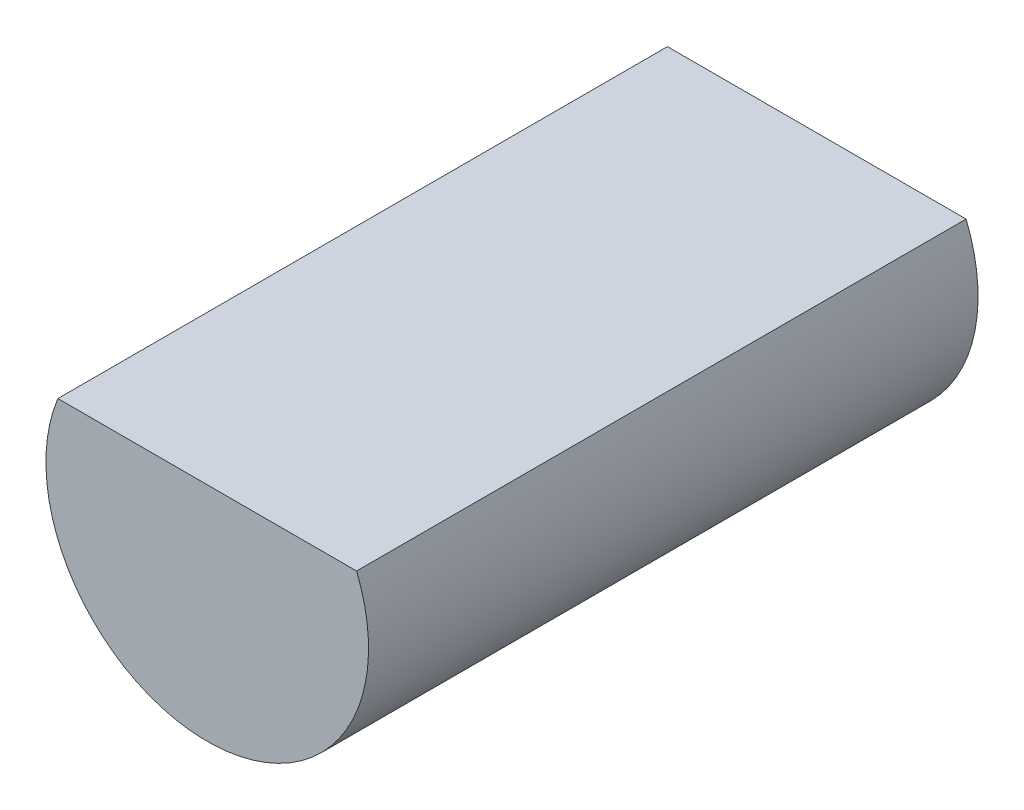
ISO-10303-21;
HEADER;
FILE_DESCRIPTION(('STEP AP214'),'2;1');
FILE_NAME('part.step','',(''),(''),'','','');
FILE_SCHEMA(('AUTOMOTIVE_DESIGN { 1 0 10303 214 1 1 1 1 }'));
ENDSEC;
DATA;
#1=APPLICATION_CONTEXT('core data for automotive mechanical design processes');
#2=APPLICATION_PROTOCOL_DEFINITION('international standard','automotive_design',2000,#1);
#3=PRODUCT_CONTEXT('',#1,'mechanical');
#4=PRODUCT('Part','Part','',(#3));
#5=PRODUCT_RELATED_PRODUCT_CATEGORY('part','',(#4));
#6=PRODUCT_DEFINITION_FORMATION('','',#4);
#7=PRODUCT_DEFINITION_CONTEXT('part definition',#1,'design');
#8=PRODUCT_DEFINITION('design','',#6,#7);
#9=PRODUCT_DEFINITION_SHAPE('','',#8);
#10=(LENGTH_UNIT() NAMED_UNIT(*) SI_UNIT(.MILLI.,.METRE.));
#11=(NAMED_UNIT(*) PLANE_ANGLE_UNIT() SI_UNIT($,.RADIAN.));
#12=(NAMED_UNIT(*) SI_UNIT($,.STERADIAN.) SOLID_ANGLE_UNIT());
#13=UNCERTAINTY_MEASURE_WITH_UNIT(LENGTH_MEASURE(1.E-05),#10,'distance_accuracy_value','');
#14=(GEOMETRIC_REPRESENTATION_CONTEXT(3) GLOBAL_UNCERTAINTY_ASSIGNED_CONTEXT((#13)) GLOBAL_UNIT_ASSIGNED_CONTEXT((#10,
#11,#12)) REPRESENTATION_CONTEXT('',''));
#15=CARTESIAN_POINT('',(0.,0.,0.));
#16=DIRECTION('',(0.,0.,1.));
#17=DIRECTION('',(1.,0.,0.));
#18=AXIS2_PLACEMENT_3D('',#15,#16,#17);
#19=CARTESIAN_POINT('',(0.,0.,20.));
#20=DIRECTION('',(0.,0.,-1.));
#21=DIRECTION('',(-1.,0.,0.));
#22=AXIS2_PLACEMENT_3D('',#19,#20,#21);
#23=CYLINDRICAL_SURFACE('',#22,5.2924474489597);
#24=CARTESIAN_POINT('',(0.,0.,0.));
#25=DIRECTION('',(0.,0.,1.));
#26=DIRECTION('',(1.,0.,0.));
#27=AXIS2_PLACEMENT_3D('',#24,#25,#26);
#28=CIRCLE('',#27,5.2924474489597);
#29=CARTESIAN_POINT('',(-4.9,2.,0.));
#30=VERTEX_POINT('',#29);
#31=CARTESIAN_POINT('',(4.9,2.,0.));
#32=VERTEX_POINT('',#31);
#33=EDGE_CURVE('E72',#30,#32,#28,.T.);
#34=ORIENTED_EDGE('',*,*,#33,.T.);
#35=DIRECTION('',(0.,0.,-1.));
#36=VECTOR('',#35,1.);
#37=CARTESIAN_POINT('',(4.9,2.,20.));
#38=LINE('',#37,#36);
#39=CARTESIAN_POINT('',(4.9,2.,20.));
#40=VERTEX_POINT('',#39);
#41=EDGE_CURVE('E11',#40,#32,#38,.T.);
#42=ORIENTED_EDGE('',*,*,#41,.F.);
#43=CARTESIAN_POINT('',(0.,0.,20.));
#44=DIRECTION('',(0.,0.,1.));
#45=DIRECTION('',(1.,0.,0.));
#46=AXIS2_PLACEMENT_3D('',#43,#44,#45);
#47=CIRCLE('',#46,5.2924474489597);
#48=CARTESIAN_POINT('',(-4.9,2.,20.));
#49=VERTEX_POINT('',#48);
#50=EDGE_CURVE('E71',#49,#40,#47,.T.);
#51=ORIENTED_EDGE('',*,*,#50,.F.);
#52=DIRECTION('',(0.,0.,-1.));
#53=VECTOR('',#52,1.);
#54=CARTESIAN_POINT('',(-4.9,2.,20.));
#55=LINE('',#54,#53);
#56=EDGE_CURVE('E49',#49,#30,#55,.T.);
#57=ORIENTED_EDGE('',*,*,#56,.T.);
#58=EDGE_LOOP('',(#34,#42,#51,#57));
#59=FACE_BOUND('',#58,.T.);
#60=ADVANCED_FACE('F41',(#59),#23,.T.);
#61=CARTESIAN_POINT('',(4.9,2.,20.));
#62=DIRECTION('',(0.,-1.,0.));
#63=DIRECTION('',(0.,0.,-1.));
#64=AXIS2_PLACEMENT_3D('',#61,#62,#63);
#65=PLANE('',#64);
#66=DIRECTION('',(-1.,0.,0.));
#67=VECTOR('',#66,1.);
#68=CARTESIAN_POINT('',(4.9,2.,0.));
#69=LINE('',#68,#67);
#70=EDGE_CURVE('E64',#32,#30,#69,.T.);
#71=ORIENTED_EDGE('',*,*,#70,.T.);
#72=ORIENTED_EDGE('',*,*,#56,.F.);
#73=DIRECTION('',(-1.,0.,0.));
#74=VECTOR('',#73,1.);
#75=CARTESIAN_POINT('',(4.9,2.,20.));
#76=LINE('',#75,#74);
#77=EDGE_CURVE('E56',#40,#49,#76,.T.);
#78=ORIENTED_EDGE('',*,*,#77,.F.);
#79=ORIENTED_EDGE('',*,*,#41,.T.);
#80=EDGE_LOOP('',(#71,#72,#78,#79));
#81=FACE_BOUND('',#80,.T.);
#82=ADVANCED_FACE('F67',(#81),#65,.F.);
#83=CARTESIAN_POINT('',(0.,0.,20.));
#84=DIRECTION('',(0.,0.,1.));
#85=DIRECTION('',(1.,0.,0.));
#86=AXIS2_PLACEMENT_3D('',#83,#84,#85);
#87=PLANE('',#86);
#88=ORIENTED_EDGE('',*,*,#50,.T.);
#89=ORIENTED_EDGE('',*,*,#77,.T.);
#90=EDGE_LOOP('',(#88,#89));
#91=FACE_BOUND('',#90,.T.);
#92=ADVANCED_FACE('F79',(#91),#87,.T.);
#93=CARTESIAN_POINT('',(0.,0.,0.));
#94=DIRECTION('',(0.,0.,1.));
#95=DIRECTION('',(1.,0.,0.));
#96=AXIS2_PLACEMENT_3D('',#93,#94,#95);
#97=PLANE('',#96);
#98=ORIENTED_EDGE('',*,*,#33,.F.);
#99=ORIENTED_EDGE('',*,*,#70,.F.);
#100=EDGE_LOOP('',(#98,#99));
#101=FACE_BOUND('',#100,.T.);
#102=ADVANCED_FACE('F75',(#101),#97,.F.);
#103=CLOSED_SHELL('',(#60,#82,#92,#102));
#104=MANIFOLD_SOLID_BREP('B2',#103);
#105=ADVANCED_BREP_SHAPE_REPRESENTATION('',(#18,#104),#14);
#106=SHAPE_DEFINITION_REPRESENTATION(#9,#105);
ENDSEC;
END-ISO-10303-21;
